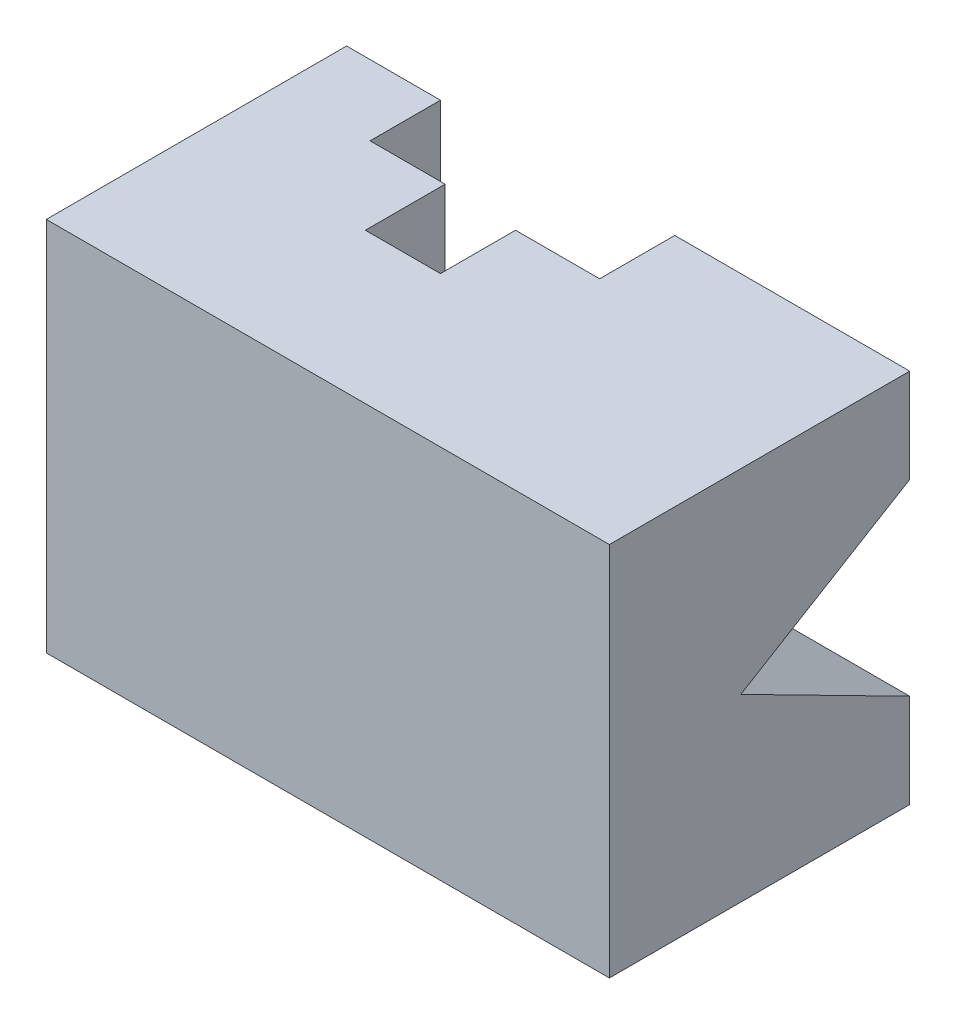
ISO-10303-21;
HEADER;
FILE_DESCRIPTION(('STEP AP214'),'2;1');
FILE_NAME('part.step','',(''),(''),'','','');
FILE_SCHEMA(('AUTOMOTIVE_DESIGN { 1 0 10303 214 1 1 1 1 }'));
ENDSEC;
DATA;
#1=APPLICATION_CONTEXT('core data for automotive mechanical design processes');
#2=APPLICATION_PROTOCOL_DEFINITION('international standard','automotive_design',2000,#1);
#3=PRODUCT_CONTEXT('',#1,'mechanical');
#4=PRODUCT('Part','Part','',(#3));
#5=PRODUCT_RELATED_PRODUCT_CATEGORY('part','',(#4));
#6=PRODUCT_DEFINITION_FORMATION('','',#4);
#7=PRODUCT_DEFINITION_CONTEXT('part definition',#1,'design');
#8=PRODUCT_DEFINITION('design','',#6,#7);
#9=PRODUCT_DEFINITION_SHAPE('','',#8);
#10=(LENGTH_UNIT() NAMED_UNIT(*) SI_UNIT(.MILLI.,.METRE.));
#11=(NAMED_UNIT(*) PLANE_ANGLE_UNIT() SI_UNIT($,.RADIAN.));
#12=(NAMED_UNIT(*) SI_UNIT($,.STERADIAN.) SOLID_ANGLE_UNIT());
#13=UNCERTAINTY_MEASURE_WITH_UNIT(LENGTH_MEASURE(1.E-05),#10,'distance_accuracy_value','');
#14=(GEOMETRIC_REPRESENTATION_CONTEXT(3) GLOBAL_UNCERTAINTY_ASSIGNED_CONTEXT((#13)) GLOBAL_UNIT_ASSIGNED_CONTEXT((#10,
#11,#12)) REPRESENTATION_CONTEXT('',''));
#15=CARTESIAN_POINT('',(0.,0.,0.));
#16=DIRECTION('',(0.,0.,1.));
#17=DIRECTION('',(1.,0.,0.));
#18=AXIS2_PLACEMENT_3D('',#15,#16,#17);
#19=CARTESIAN_POINT('',(-105.576923076923,-100.,-56.3942307692308));
#20=DIRECTION('',(-1.,0.,0.));
#21=DIRECTION('',(0.,0.,1.));
#22=AXIS2_PLACEMENT_3D('',#19,#20,#21);
#23=PLANE('',#22);
#24=DIRECTION('',(0.,0.,1.));
#25=VECTOR('',#24,1.);
#26=CARTESIAN_POINT('',(-105.576923076923,0.,-56.3942307692308));
#27=LINE('',#26,#25);
#28=CARTESIAN_POINT('',(-105.576923076923,0.,-56.3942307692308));
#29=VERTEX_POINT('',#28);
#30=CARTESIAN_POINT('',(-105.576923076923,0.,23.6057692307692));
#31=VERTEX_POINT('',#30);
#32=EDGE_CURVE('E185',#29,#31,#27,.T.);
#33=ORIENTED_EDGE('',*,*,#32,.F.);
#34=DIRECTION('',(0.,1.,0.));
#35=VECTOR('',#34,1.);
#36=CARTESIAN_POINT('',(-105.576923076923,-100.,-56.3942307692308));
#37=LINE('',#36,#35);
#38=CARTESIAN_POINT('',(-105.576923076923,-100.,-56.3942307692308));
#39=VERTEX_POINT('',#38);
#40=EDGE_CURVE('E11',#39,#29,#37,.T.);
#41=ORIENTED_EDGE('',*,*,#40,.F.);
#42=DIRECTION('',(0.,0.,1.));
#43=VECTOR('',#42,1.);
#44=CARTESIAN_POINT('',(-105.576923076923,-100.,-56.3942307692308));
#45=LINE('',#44,#43);
#46=CARTESIAN_POINT('',(-105.576923076923,-100.,23.6057692307692));
#47=VERTEX_POINT('',#46);
#48=EDGE_CURVE('E230',#39,#47,#45,.T.);
#49=ORIENTED_EDGE('',*,*,#48,.T.);
#50=DIRECTION('',(0.,1.,0.));
#51=VECTOR('',#50,1.);
#52=CARTESIAN_POINT('',(-105.576923076923,-100.,23.6057692307692));
#53=LINE('',#52,#51);
#54=EDGE_CURVE('E48',#47,#31,#53,.T.);
#55=ORIENTED_EDGE('',*,*,#54,.T.);
#56=EDGE_LOOP('',(#33,#41,#49,#55));
#57=FACE_BOUND('',#56,.T.);
#58=ADVANCED_FACE('F45',(#57),#23,.T.);
#59=CARTESIAN_POINT('',(-80.5769230769231,-100.,-56.3942307692308));
#60=DIRECTION('',(0.,0.,-1.));
#61=DIRECTION('',(-1.,0.,0.));
#62=AXIS2_PLACEMENT_3D('',#59,#60,#61);
#63=PLANE('',#62);
#64=DIRECTION('',(-1.,0.,0.));
#65=VECTOR('',#64,1.);
#66=CARTESIAN_POINT('',(-80.5769230769231,0.,-56.3942307692308));
#67=LINE('',#66,#65);
#68=CARTESIAN_POINT('',(-80.5769230769231,0.,-56.3942307692308));
#69=VERTEX_POINT('',#68);
#70=EDGE_CURVE('E227',#69,#29,#67,.T.);
#71=ORIENTED_EDGE('',*,*,#70,.F.);
#72=DIRECTION('',(0.,1.,0.));
#73=VECTOR('',#72,1.);
#74=CARTESIAN_POINT('',(-80.5769230769231,-100.,-56.3942307692308));
#75=LINE('',#74,#73);
#76=CARTESIAN_POINT('',(-80.5769230769231,-100.,-56.3942307692308));
#77=VERTEX_POINT('',#76);
#78=EDGE_CURVE('E54',#77,#69,#75,.T.);
#79=ORIENTED_EDGE('',*,*,#78,.F.);
#80=DIRECTION('',(-1.,0.,0.));
#81=VECTOR('',#80,1.);
#82=CARTESIAN_POINT('',(-80.5769230769231,-100.,-56.3942307692308));
#83=LINE('',#82,#81);
#84=EDGE_CURVE('E171',#77,#39,#83,.T.);
#85=ORIENTED_EDGE('',*,*,#84,.T.);
#86=ORIENTED_EDGE('',*,*,#40,.T.);
#87=EDGE_LOOP('',(#71,#79,#85,#86));
#88=FACE_BOUND('',#87,.T.);
#89=ADVANCED_FACE('F263',(#88),#63,.T.);
#90=CARTESIAN_POINT('',(-80.5769230769231,-100.,-37.6442307692308));
#91=DIRECTION('',(1.,0.,0.));
#92=DIRECTION('',(0.,0.,-1.));
#93=AXIS2_PLACEMENT_3D('',#90,#91,#92);
#94=PLANE('',#93);
#95=DIRECTION('',(0.,0.,-1.));
#96=VECTOR('',#95,1.);
#97=CARTESIAN_POINT('',(-80.5769230769231,0.,-37.6442307692308));
#98=LINE('',#97,#96);
#99=CARTESIAN_POINT('',(-80.5769230769231,0.,-37.6442307692308));
#100=VERTEX_POINT('',#99);
#101=EDGE_CURVE('E157',#100,#69,#98,.T.);
#102=ORIENTED_EDGE('',*,*,#101,.F.);
#103=DIRECTION('',(0.,1.,0.));
#104=VECTOR('',#103,1.);
#105=CARTESIAN_POINT('',(-80.5769230769231,-100.,-37.6442307692308));
#106=LINE('',#105,#104);
#107=CARTESIAN_POINT('',(-80.5769230769231,-100.,-37.6442307692308));
#108=VERTEX_POINT('',#107);
#109=EDGE_CURVE('E151',#108,#100,#106,.T.);
#110=ORIENTED_EDGE('',*,*,#109,.F.);
#111=DIRECTION('',(0.,0.,-1.));
#112=VECTOR('',#111,1.);
#113=CARTESIAN_POINT('',(-80.5769230769231,-100.,-37.6442307692308));
#114=LINE('',#113,#112);
#115=EDGE_CURVE('E154',#108,#77,#114,.T.);
#116=ORIENTED_EDGE('',*,*,#115,.T.);
#117=ORIENTED_EDGE('',*,*,#78,.T.);
#118=EDGE_LOOP('',(#102,#110,#116,#117));
#119=FACE_BOUND('',#118,.T.);
#120=ADVANCED_FACE('F153',(#119),#94,.T.);
#121=CARTESIAN_POINT('',(-60.5769230769231,-100.,-37.6442307692308));
#122=DIRECTION('',(0.,0.,-1.));
#123=DIRECTION('',(-1.,0.,0.));
#124=AXIS2_PLACEMENT_3D('',#121,#122,#123);
#125=PLANE('',#124);
#126=DIRECTION('',(-1.,0.,0.));
#127=VECTOR('',#126,1.);
#128=CARTESIAN_POINT('',(-60.5769230769231,0.,-37.6442307692308));
#129=LINE('',#128,#127);
#130=CARTESIAN_POINT('',(-60.5769230769231,0.,-37.6442307692308));
#131=VERTEX_POINT('',#130);
#132=EDGE_CURVE('E222',#131,#100,#129,.T.);
#133=ORIENTED_EDGE('',*,*,#132,.F.);
#134=DIRECTION('',(0.,1.,0.));
#135=VECTOR('',#134,1.);
#136=CARTESIAN_POINT('',(-60.5769230769231,-100.,-37.6442307692308));
#137=LINE('',#136,#135);
#138=CARTESIAN_POINT('',(-60.5769230769231,-100.,-37.6442307692308));
#139=VERTEX_POINT('',#138);
#140=EDGE_CURVE('E163',#139,#131,#137,.T.);
#141=ORIENTED_EDGE('',*,*,#140,.F.);
#142=DIRECTION('',(-1.,0.,0.));
#143=VECTOR('',#142,1.);
#144=CARTESIAN_POINT('',(-60.5769230769231,-100.,-37.6442307692308));
#145=LINE('',#144,#143);
#146=EDGE_CURVE('E169',#139,#108,#145,.T.);
#147=ORIENTED_EDGE('',*,*,#146,.T.);
#148=ORIENTED_EDGE('',*,*,#109,.T.);
#149=EDGE_LOOP('',(#133,#141,#147,#148));
#150=FACE_BOUND('',#149,.T.);
#151=ADVANCED_FACE('F174',(#150),#125,.T.);
#152=CARTESIAN_POINT('',(-60.5769230769231,-100.,-16.3942307692307));
#153=DIRECTION('',(1.,0.,0.));
#154=DIRECTION('',(0.,0.,-1.));
#155=AXIS2_PLACEMENT_3D('',#152,#153,#154);
#156=PLANE('',#155);
#157=DIRECTION('',(0.,0.,-1.));
#158=VECTOR('',#157,1.);
#159=CARTESIAN_POINT('',(-60.5769230769231,0.,-16.3942307692307));
#160=LINE('',#159,#158);
#161=CARTESIAN_POINT('',(-60.5769230769231,0.,-16.3942307692307));
#162=VERTEX_POINT('',#161);
#163=EDGE_CURVE('E218',#162,#131,#160,.T.);
#164=ORIENTED_EDGE('',*,*,#163,.F.);
#165=DIRECTION('',(0.,1.,0.));
#166=VECTOR('',#165,1.);
#167=CARTESIAN_POINT('',(-60.5769230769231,-100.,-16.3942307692307));
#168=LINE('',#167,#166);
#169=CARTESIAN_POINT('',(-60.5769230769231,-100.,-16.3942307692307));
#170=VERTEX_POINT('',#169);
#171=EDGE_CURVE('E236',#170,#162,#168,.T.);
#172=ORIENTED_EDGE('',*,*,#171,.F.);
#173=DIRECTION('',(0.,0.,-1.));
#174=VECTOR('',#173,1.);
#175=CARTESIAN_POINT('',(-60.5769230769231,-100.,-16.3942307692307));
#176=LINE('',#175,#174);
#177=EDGE_CURVE('E176',#170,#139,#176,.T.);
#178=ORIENTED_EDGE('',*,*,#177,.T.);
#179=ORIENTED_EDGE('',*,*,#140,.T.);
#180=EDGE_LOOP('',(#164,#172,#178,#179));
#181=FACE_BOUND('',#180,.T.);
#182=ADVANCED_FACE('F276',(#181),#156,.T.);
#183=CARTESIAN_POINT('',(-40.5769230769231,-100.,-16.3942307692307));
#184=DIRECTION('',(0.,0.,-1.));
#185=DIRECTION('',(-1.,0.,0.));
#186=AXIS2_PLACEMENT_3D('',#183,#184,#185);
#187=PLANE('',#186);
#188=DIRECTION('',(-1.,0.,0.));
#189=VECTOR('',#188,1.);
#190=CARTESIAN_POINT('',(-40.5769230769231,0.,-16.3942307692307));
#191=LINE('',#190,#189);
#192=CARTESIAN_POINT('',(-40.5769230769231,0.,-16.3942307692307));
#193=VERTEX_POINT('',#192);
#194=EDGE_CURVE('E214',#193,#162,#191,.T.);
#195=ORIENTED_EDGE('',*,*,#194,.F.);
#196=DIRECTION('',(0.,1.,0.));
#197=VECTOR('',#196,1.);
#198=CARTESIAN_POINT('',(-40.5769230769231,-100.,-16.3942307692307));
#199=LINE('',#198,#197);
#200=CARTESIAN_POINT('',(-40.5769230769231,-100.,-16.3942307692307));
#201=VERTEX_POINT('',#200);
#202=EDGE_CURVE('E239',#201,#193,#199,.T.);
#203=ORIENTED_EDGE('',*,*,#202,.F.);
#204=DIRECTION('',(-1.,0.,0.));
#205=VECTOR('',#204,1.);
#206=CARTESIAN_POINT('',(-40.5769230769231,-100.,-16.3942307692307));
#207=LINE('',#206,#205);
#208=EDGE_CURVE('E179',#201,#170,#207,.T.);
#209=ORIENTED_EDGE('',*,*,#208,.T.);
#210=ORIENTED_EDGE('',*,*,#171,.T.);
#211=EDGE_LOOP('',(#195,#203,#209,#210));
#212=FACE_BOUND('',#211,.T.);
#213=ADVANCED_FACE('F279',(#212),#187,.T.);
#214=CARTESIAN_POINT('',(-40.5769230769231,-100.,-36.3942307692307));
#215=DIRECTION('',(-1.,0.,0.));
#216=DIRECTION('',(0.,0.,1.));
#217=AXIS2_PLACEMENT_3D('',#214,#215,#216);
#218=PLANE('',#217);
#219=DIRECTION('',(0.,0.,1.));
#220=VECTOR('',#219,1.);
#221=CARTESIAN_POINT('',(-40.5769230769231,0.,-36.3942307692307));
#222=LINE('',#221,#220);
#223=CARTESIAN_POINT('',(-40.5769230769231,0.,-36.3942307692307));
#224=VERTEX_POINT('',#223);
#225=EDGE_CURVE('E210',#224,#193,#222,.T.);
#226=ORIENTED_EDGE('',*,*,#225,.F.);
#227=DIRECTION('',(0.,1.,0.));
#228=VECTOR('',#227,1.);
#229=CARTESIAN_POINT('',(-40.5769230769231,-100.,-36.3942307692307));
#230=LINE('',#229,#228);
#231=CARTESIAN_POINT('',(-40.5769230769231,-100.,-36.3942307692307));
#232=VERTEX_POINT('',#231);
#233=EDGE_CURVE('E242',#232,#224,#230,.T.);
#234=ORIENTED_EDGE('',*,*,#233,.F.);
#235=DIRECTION('',(0.,0.,1.));
#236=VECTOR('',#235,1.);
#237=CARTESIAN_POINT('',(-40.5769230769231,-100.,-36.3942307692307));
#238=LINE('',#237,#236);
#239=EDGE_CURVE('E381',#232,#201,#238,.T.);
#240=ORIENTED_EDGE('',*,*,#239,.T.);
#241=ORIENTED_EDGE('',*,*,#202,.T.);
#242=EDGE_LOOP('',(#226,#234,#240,#241));
#243=FACE_BOUND('',#242,.T.);
#244=ADVANCED_FACE('F283',(#243),#218,.T.);
#245=CARTESIAN_POINT('',(-18.173076923077,-100.,-36.3942307692307));
#246=DIRECTION('',(0.,0.,-1.));
#247=DIRECTION('',(-1.,0.,0.));
#248=AXIS2_PLACEMENT_3D('',#245,#246,#247);
#249=PLANE('',#248);
#250=DIRECTION('',(-1.,0.,0.));
#251=VECTOR('',#250,1.);
#252=CARTESIAN_POINT('',(-18.173076923077,0.,-36.3942307692307));
#253=LINE('',#252,#251);
#254=CARTESIAN_POINT('',(-18.173076923077,0.,-36.3942307692307));
#255=VERTEX_POINT('',#254);
#256=EDGE_CURVE('E206',#255,#224,#253,.T.);
#257=ORIENTED_EDGE('',*,*,#256,.F.);
#258=DIRECTION('',(0.,1.,0.));
#259=VECTOR('',#258,1.);
#260=CARTESIAN_POINT('',(-18.173076923077,-100.,-36.3942307692307));
#261=LINE('',#260,#259);
#262=CARTESIAN_POINT('',(-18.173076923077,-100.,-36.3942307692307));
#263=VERTEX_POINT('',#262);
#264=EDGE_CURVE('E245',#263,#255,#261,.T.);
#265=ORIENTED_EDGE('',*,*,#264,.F.);
#266=DIRECTION('',(-1.,0.,0.));
#267=VECTOR('',#266,1.);
#268=CARTESIAN_POINT('',(-18.173076923077,-100.,-36.3942307692307));
#269=LINE('',#268,#267);
#270=EDGE_CURVE('E377',#263,#232,#269,.T.);
#271=ORIENTED_EDGE('',*,*,#270,.T.);
#272=ORIENTED_EDGE('',*,*,#233,.T.);
#273=EDGE_LOOP('',(#257,#265,#271,#272));
#274=FACE_BOUND('',#273,.T.);
#275=ADVANCED_FACE('F287',(#274),#249,.T.);
#276=CARTESIAN_POINT('',(-18.173076923077,-100.,-56.3942307692308));
#277=DIRECTION('',(-1.,0.,0.));
#278=DIRECTION('',(0.,0.,1.));
#279=AXIS2_PLACEMENT_3D('',#276,#277,#278);
#280=PLANE('',#279);
#281=DIRECTION('',(0.,0.,1.));
#282=VECTOR('',#281,1.);
#283=CARTESIAN_POINT('',(-18.173076923077,0.,-56.3942307692308));
#284=LINE('',#283,#282);
#285=CARTESIAN_POINT('',(-18.173076923077,0.,-56.3942307692308));
#286=VERTEX_POINT('',#285);
#287=EDGE_CURVE('E202',#286,#255,#284,.T.);
#288=ORIENTED_EDGE('',*,*,#287,.F.);
#289=DIRECTION('',(0.,1.,0.));
#290=VECTOR('',#289,1.);
#291=CARTESIAN_POINT('',(-18.173076923077,-100.,-56.3942307692308));
#292=LINE('',#291,#290);
#293=CARTESIAN_POINT('',(-18.173076923077,-100.,-56.3942307692308));
#294=VERTEX_POINT('',#293);
#295=EDGE_CURVE('E248',#294,#286,#292,.T.);
#296=ORIENTED_EDGE('',*,*,#295,.F.);
#297=DIRECTION('',(0.,0.,1.));
#298=VECTOR('',#297,1.);
#299=CARTESIAN_POINT('',(-18.173076923077,-100.,-56.3942307692308));
#300=LINE('',#299,#298);
#301=EDGE_CURVE('E373',#294,#263,#300,.T.);
#302=ORIENTED_EDGE('',*,*,#301,.T.);
#303=ORIENTED_EDGE('',*,*,#264,.T.);
#304=EDGE_LOOP('',(#288,#296,#302,#303));
#305=FACE_BOUND('',#304,.T.);
#306=ADVANCED_FACE('F291',(#305),#280,.T.);
#307=CARTESIAN_POINT('',(44.4230769230769,-100.,-56.3942307692308));
#308=DIRECTION('',(0.,0.,-1.));
#309=DIRECTION('',(-1.,0.,0.));
#310=AXIS2_PLACEMENT_3D('',#307,#308,#309);
#311=PLANE('',#310);
#312=DIRECTION('',(1.,0.,0.));
#313=VECTOR('',#312,1.);
#314=CARTESIAN_POINT('',(-5.57692307692312,-75.,-56.3942307692308));
#315=LINE('',#314,#313);
#316=CARTESIAN_POINT('',(-5.57692307692312,-75.,-56.3942307692308));
#317=VERTEX_POINT('',#316);
#318=CARTESIAN_POINT('',(44.4230769230769,-75.,-56.3942307692308));
#319=VERTEX_POINT('',#318);
#320=EDGE_CURVE('E341',#317,#319,#315,.T.);
#321=ORIENTED_EDGE('',*,*,#320,.T.);
#322=DIRECTION('',(0.,1.,0.));
#323=VECTOR('',#322,1.);
#324=CARTESIAN_POINT('',(44.4230769230769,-100.,-56.3942307692308));
#325=LINE('',#324,#323);
#326=CARTESIAN_POINT('',(44.4230769230769,-100.,-56.3942307692308));
#327=VERTEX_POINT('',#326);
#328=EDGE_CURVE('E251',#327,#319,#325,.T.);
#329=ORIENTED_EDGE('',*,*,#328,.F.);
#330=DIRECTION('',(-1.,0.,0.));
#331=VECTOR('',#330,1.);
#332=CARTESIAN_POINT('',(44.4230769230769,-100.,-56.3942307692308));
#333=LINE('',#332,#331);
#334=EDGE_CURVE('E369',#327,#294,#333,.T.);
#335=ORIENTED_EDGE('',*,*,#334,.T.);
#336=ORIENTED_EDGE('',*,*,#295,.T.);
#337=DIRECTION('',(-1.,0.,0.));
#338=VECTOR('',#337,1.);
#339=CARTESIAN_POINT('',(44.4230769230769,0.,-56.3942307692308));
#340=LINE('',#339,#338);
#341=CARTESIAN_POINT('',(44.4230769230769,0.,-56.3942307692308));
#342=VERTEX_POINT('',#341);
#343=EDGE_CURVE('E198',#342,#286,#340,.T.);
#344=ORIENTED_EDGE('',*,*,#343,.F.);
#345=CARTESIAN_POINT('',(44.4230769230769,-25.,-56.3942307692308));
#346=VERTEX_POINT('',#345);
#347=EDGE_CURVE('E254',#346,#342,#325,.T.);
#348=ORIENTED_EDGE('',*,*,#347,.F.);
#349=DIRECTION('',(1.,0.,0.));
#350=VECTOR('',#349,1.);
#351=CARTESIAN_POINT('',(-5.57692307692312,-25.,-56.3942307692308));
#352=LINE('',#351,#350);
#353=CARTESIAN_POINT('',(-5.57692307692312,-25.,-56.3942307692308));
#354=VERTEX_POINT('',#353);
#355=EDGE_CURVE('E62',#354,#346,#352,.T.);
#356=ORIENTED_EDGE('',*,*,#355,.F.);
#357=DIRECTION('',(0.,1.,0.));
#358=VECTOR('',#357,1.);
#359=CARTESIAN_POINT('',(-5.57692307692312,-25.,-56.3942307692308));
#360=LINE('',#359,#358);
#361=EDGE_CURVE('E331',#317,#354,#360,.T.);
#362=ORIENTED_EDGE('',*,*,#361,.F.);
#363=EDGE_LOOP('',(#321,#329,#335,#336,#344,#348,#356,#362));
#364=FACE_BOUND('',#363,.T.);
#365=ADVANCED_FACE('F295',(#364),#311,.T.);
#366=CARTESIAN_POINT('',(44.4230769230769,-100.,23.6057692307692));
#367=DIRECTION('',(1.,0.,0.));
#368=DIRECTION('',(0.,0.,-1.));
#369=AXIS2_PLACEMENT_3D('',#366,#367,#368);
#370=PLANE('',#369);
#371=DIRECTION('',(0.,-0.453954078678629,-0.89102508070819));
#372=VECTOR('',#371,1.);
#373=CARTESIAN_POINT('',(44.4230769230769,-75.,-56.3942307692308));
#374=LINE('',#373,#372);
#375=CARTESIAN_POINT('',(44.4230769230769,-52.0736716812707,-11.3942307692308));
#376=VERTEX_POINT('',#375);
#377=EDGE_CURVE('E348',#376,#319,#374,.T.);
#378=ORIENTED_EDGE('',*,*,#377,.F.);
#379=DIRECTION('',(0.,-0.515526875095871,0.856873410168554));
#380=VECTOR('',#379,1.);
#381=CARTESIAN_POINT('',(44.4230769230769,-25.,-56.3942307692308));
#382=LINE('',#381,#380);
#383=EDGE_CURVE('E337',#346,#376,#382,.T.);
#384=ORIENTED_EDGE('',*,*,#383,.F.);
#385=ORIENTED_EDGE('',*,*,#347,.T.);
#386=DIRECTION('',(0.,0.,-1.));
#387=VECTOR('',#386,1.);
#388=CARTESIAN_POINT('',(44.4230769230769,0.,23.6057692307692));
#389=LINE('',#388,#387);
#390=CARTESIAN_POINT('',(44.4230769230769,0.,23.6057692307692));
#391=VERTEX_POINT('',#390);
#392=EDGE_CURVE('E194',#391,#342,#389,.T.);
#393=ORIENTED_EDGE('',*,*,#392,.F.);
#394=DIRECTION('',(0.,1.,0.));
#395=VECTOR('',#394,1.);
#396=CARTESIAN_POINT('',(44.4230769230769,-100.,23.6057692307692));
#397=LINE('',#396,#395);
#398=CARTESIAN_POINT('',(44.4230769230769,-100.,23.6057692307692));
#399=VERTEX_POINT('',#398);
#400=EDGE_CURVE('E255',#399,#391,#397,.T.);
#401=ORIENTED_EDGE('',*,*,#400,.F.);
#402=DIRECTION('',(0.,0.,-1.));
#403=VECTOR('',#402,1.);
#404=CARTESIAN_POINT('',(44.4230769230769,-100.,23.6057692307692));
#405=LINE('',#404,#403);
#406=EDGE_CURVE('E365',#399,#327,#405,.T.);
#407=ORIENTED_EDGE('',*,*,#406,.T.);
#408=ORIENTED_EDGE('',*,*,#328,.T.);
#409=EDGE_LOOP('',(#378,#384,#385,#393,#401,#407,#408));
#410=FACE_BOUND('',#409,.T.);
#411=ADVANCED_FACE('F299',(#410),#370,.T.);
#412=CARTESIAN_POINT('',(-105.576923076923,-100.,23.6057692307692));
#413=DIRECTION('',(0.,0.,1.));
#414=DIRECTION('',(1.,0.,0.));
#415=AXIS2_PLACEMENT_3D('',#412,#413,#414);
#416=PLANE('',#415);
#417=DIRECTION('',(1.,0.,0.));
#418=VECTOR('',#417,1.);
#419=CARTESIAN_POINT('',(-105.576923076923,0.,23.6057692307692));
#420=LINE('',#419,#418);
#421=EDGE_CURVE('E189',#31,#391,#420,.T.);
#422=ORIENTED_EDGE('',*,*,#421,.F.);
#423=ORIENTED_EDGE('',*,*,#54,.F.);
#424=DIRECTION('',(1.,0.,0.));
#425=VECTOR('',#424,1.);
#426=CARTESIAN_POINT('',(-105.576923076923,-100.,23.6057692307692));
#427=LINE('',#426,#425);
#428=EDGE_CURVE('E362',#47,#399,#427,.T.);
#429=ORIENTED_EDGE('',*,*,#428,.T.);
#430=ORIENTED_EDGE('',*,*,#400,.T.);
#431=EDGE_LOOP('',(#422,#423,#429,#430));
#432=FACE_BOUND('',#431,.T.);
#433=ADVANCED_FACE('F260',(#432),#416,.T.);
#434=CARTESIAN_POINT('',(0.,-100.,0.));
#435=DIRECTION('',(0.,1.,0.));
#436=DIRECTION('',(0.,0.,1.));
#437=AXIS2_PLACEMENT_3D('',#434,#435,#436);
#438=PLANE('',#437);
#439=ORIENTED_EDGE('',*,*,#48,.F.);
#440=ORIENTED_EDGE('',*,*,#84,.F.);
#441=ORIENTED_EDGE('',*,*,#115,.F.);
#442=ORIENTED_EDGE('',*,*,#146,.F.);
#443=ORIENTED_EDGE('',*,*,#177,.F.);
#444=ORIENTED_EDGE('',*,*,#208,.F.);
#445=ORIENTED_EDGE('',*,*,#239,.F.);
#446=ORIENTED_EDGE('',*,*,#270,.F.);
#447=ORIENTED_EDGE('',*,*,#301,.F.);
#448=ORIENTED_EDGE('',*,*,#334,.F.);
#449=ORIENTED_EDGE('',*,*,#406,.F.);
#450=ORIENTED_EDGE('',*,*,#428,.F.);
#451=EDGE_LOOP('',(#439,#440,#441,#442,#443,#444,#445,#446,#447,#448,#449,#450));
#452=FACE_BOUND('',#451,.T.);
#453=ADVANCED_FACE('F167',(#452),#438,.F.);
#454=CARTESIAN_POINT('',(0.,0.,0.));
#455=DIRECTION('',(0.,1.,0.));
#456=DIRECTION('',(0.,0.,1.));
#457=AXIS2_PLACEMENT_3D('',#454,#455,#456);
#458=PLANE('',#457);
#459=ORIENTED_EDGE('',*,*,#32,.T.);
#460=ORIENTED_EDGE('',*,*,#421,.T.);
#461=ORIENTED_EDGE('',*,*,#392,.T.);
#462=ORIENTED_EDGE('',*,*,#343,.T.);
#463=ORIENTED_EDGE('',*,*,#287,.T.);
#464=ORIENTED_EDGE('',*,*,#256,.T.);
#465=ORIENTED_EDGE('',*,*,#225,.T.);
#466=ORIENTED_EDGE('',*,*,#194,.T.);
#467=ORIENTED_EDGE('',*,*,#163,.T.);
#468=ORIENTED_EDGE('',*,*,#132,.T.);
#469=ORIENTED_EDGE('',*,*,#101,.T.);
#470=ORIENTED_EDGE('',*,*,#70,.T.);
#471=EDGE_LOOP('',(#459,#460,#461,#462,#463,#464,#465,#466,#467,#468,#469,#470));
#472=FACE_BOUND('',#471,.T.);
#473=ADVANCED_FACE('F262',(#472),#458,.T.);
#474=CARTESIAN_POINT('',(-5.57692307692312,-75.,-56.3942307692308));
#475=DIRECTION('',(0.,-0.89102508070819,0.453954078678629));
#476=DIRECTION('',(0.,-0.453954078678629,-0.89102508070819));
#477=AXIS2_PLACEMENT_3D('',#474,#475,#476);
#478=PLANE('',#477);
#479=ORIENTED_EDGE('',*,*,#377,.T.);
#480=ORIENTED_EDGE('',*,*,#320,.F.);
#481=DIRECTION('',(0.,-0.453954078678629,-0.89102508070819));
#482=VECTOR('',#481,1.);
#483=CARTESIAN_POINT('',(-5.57692307692312,-75.,-56.3942307692308));
#484=LINE('',#483,#482);
#485=CARTESIAN_POINT('',(-5.57692307692312,-52.0736716812707,-11.3942307692308));
#486=VERTEX_POINT('',#485);
#487=EDGE_CURVE('E328',#486,#317,#484,.T.);
#488=ORIENTED_EDGE('',*,*,#487,.F.);
#489=DIRECTION('',(1.,0.,0.));
#490=VECTOR('',#489,1.);
#491=CARTESIAN_POINT('',(-5.57692307692312,-52.0736716812707,-11.3942307692308));
#492=LINE('',#491,#490);
#493=EDGE_CURVE('E190',#486,#376,#492,.T.);
#494=ORIENTED_EDGE('',*,*,#493,.T.);
#495=EDGE_LOOP('',(#479,#480,#488,#494));
#496=FACE_BOUND('',#495,.T.);
#497=ADVANCED_FACE('F310',(#496),#478,.F.);
#498=CARTESIAN_POINT('',(-5.57692307692312,-25.,-56.3942307692308));
#499=DIRECTION('',(0.,0.856873410168554,0.515526875095871));
#500=DIRECTION('',(0.,-0.515526875095871,0.856873410168554));
#501=AXIS2_PLACEMENT_3D('',#498,#499,#500);
#502=PLANE('',#501);
#503=ORIENTED_EDGE('',*,*,#383,.T.);
#504=ORIENTED_EDGE('',*,*,#493,.F.);
#505=DIRECTION('',(0.,-0.515526875095871,0.856873410168554));
#506=VECTOR('',#505,1.);
#507=CARTESIAN_POINT('',(-5.57692307692312,-25.,-56.3942307692308));
#508=LINE('',#507,#506);
#509=EDGE_CURVE('E332',#354,#486,#508,.T.);
#510=ORIENTED_EDGE('',*,*,#509,.F.);
#511=ORIENTED_EDGE('',*,*,#355,.T.);
#512=EDGE_LOOP('',(#503,#504,#510,#511));
#513=FACE_BOUND('',#512,.T.);
#514=ADVANCED_FACE('F314',(#513),#502,.F.);
#515=CARTESIAN_POINT('',(-5.57692307692312,0.,0.));
#516=DIRECTION('',(1.,0.,0.));
#517=DIRECTION('',(0.,0.,-1.));
#518=AXIS2_PLACEMENT_3D('',#515,#516,#517);
#519=PLANE('',#518);
#520=ORIENTED_EDGE('',*,*,#487,.T.);
#521=ORIENTED_EDGE('',*,*,#361,.T.);
#522=ORIENTED_EDGE('',*,*,#509,.T.);
#523=EDGE_LOOP('',(#520,#521,#522));
#524=FACE_BOUND('',#523,.T.);
#525=ADVANCED_FACE('F318',(#524),#519,.T.);
#526=CLOSED_SHELL('',(#58,#89,#120,#151,#182,#213,#244,#275,#306,#365,#411,#433,#453,#473,#497,
#514,#525));
#527=MANIFOLD_SOLID_BREP('B2',#526);
#528=ADVANCED_BREP_SHAPE_REPRESENTATION('',(#18,#527),#14);
#529=SHAPE_DEFINITION_REPRESENTATION(#9,#528);
ENDSEC;
END-ISO-10303-21;
